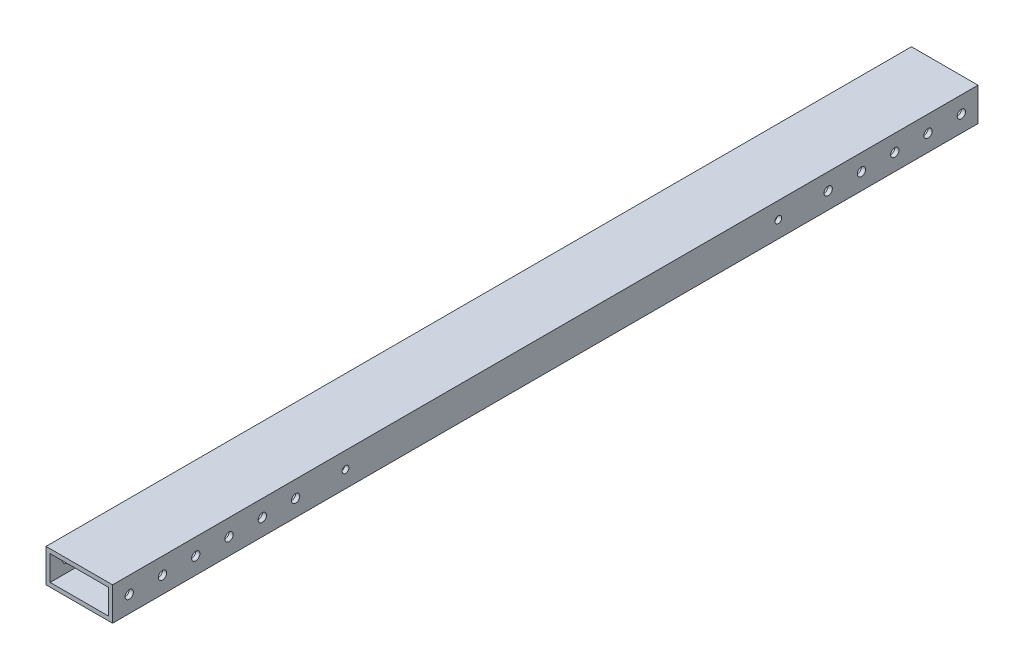
ISO-10303-21;
HEADER;
FILE_DESCRIPTION(('STEP AP214'),'2;1');
FILE_NAME('part.step','',(''),(''),'','','');
FILE_SCHEMA(('AUTOMOTIVE_DESIGN { 1 0 10303 214 1 1 1 1 }'));
ENDSEC;
DATA;
#1=APPLICATION_CONTEXT('core data for automotive mechanical design processes');
#2=APPLICATION_PROTOCOL_DEFINITION('international standard','automotive_design',2000,#1);
#3=PRODUCT_CONTEXT('',#1,'mechanical');
#4=PRODUCT('Part','Part','',(#3));
#5=PRODUCT_RELATED_PRODUCT_CATEGORY('part','',(#4));
#6=PRODUCT_DEFINITION_FORMATION('','',#4);
#7=PRODUCT_DEFINITION_CONTEXT('part definition',#1,'design');
#8=PRODUCT_DEFINITION('design','',#6,#7);
#9=PRODUCT_DEFINITION_SHAPE('','',#8);
#10=(LENGTH_UNIT() NAMED_UNIT(*) SI_UNIT(.MILLI.,.METRE.));
#11=(NAMED_UNIT(*) PLANE_ANGLE_UNIT() SI_UNIT($,.RADIAN.));
#12=(NAMED_UNIT(*) SI_UNIT($,.STERADIAN.) SOLID_ANGLE_UNIT());
#13=UNCERTAINTY_MEASURE_WITH_UNIT(LENGTH_MEASURE(1.E-05),#10,'distance_accuracy_value','');
#14=(GEOMETRIC_REPRESENTATION_CONTEXT(3) GLOBAL_UNCERTAINTY_ASSIGNED_CONTEXT((#13)) GLOBAL_UNIT_ASSIGNED_CONTEXT((#10,
#11,#12)) REPRESENTATION_CONTEXT('',''));
#15=CARTESIAN_POINT('',(0.,0.,0.));
#16=DIRECTION('',(0.,0.,1.));
#17=DIRECTION('',(1.,0.,0.));
#18=AXIS2_PLACEMENT_3D('',#15,#16,#17);
#19=CARTESIAN_POINT('',(0.,0.,330.2));
#20=DIRECTION('',(0.,0.,1.));
#21=DIRECTION('',(1.,0.,0.));
#22=AXIS2_PLACEMENT_3D('',#19,#20,#21);
#23=PLANE('',#22);
#24=DIRECTION('',(0.,-1.,0.));
#25=VECTOR('',#24,1.);
#26=CARTESIAN_POINT('',(-25.4,12.7,330.2));
#27=LINE('',#26,#25);
#28=CARTESIAN_POINT('',(-25.4,12.7,330.2));
#29=VERTEX_POINT('',#28);
#30=CARTESIAN_POINT('',(-25.4,-12.7,330.2));
#31=VERTEX_POINT('',#30);
#32=EDGE_CURVE('E115',#29,#31,#27,.T.);
#33=ORIENTED_EDGE('',*,*,#32,.T.);
#34=DIRECTION('',(1.,0.,0.));
#35=VECTOR('',#34,1.);
#36=CARTESIAN_POINT('',(-25.4,-12.7,330.2));
#37=LINE('',#36,#35);
#38=CARTESIAN_POINT('',(25.4,-12.7,330.2));
#39=VERTEX_POINT('',#38);
#40=EDGE_CURVE('E163',#31,#39,#37,.T.);
#41=ORIENTED_EDGE('',*,*,#40,.T.);
#42=DIRECTION('',(0.,1.,0.));
#43=VECTOR('',#42,1.);
#44=CARTESIAN_POINT('',(25.4,-12.7,330.2));
#45=LINE('',#44,#43);
#46=CARTESIAN_POINT('',(25.4,12.7,330.2));
#47=VERTEX_POINT('',#46);
#48=EDGE_CURVE('E165',#39,#47,#45,.T.);
#49=ORIENTED_EDGE('',*,*,#48,.T.);
#50=DIRECTION('',(-1.,0.,0.));
#51=VECTOR('',#50,1.);
#52=CARTESIAN_POINT('',(25.4,12.7,330.2));
#53=LINE('',#52,#51);
#54=EDGE_CURVE('E62',#47,#29,#53,.T.);
#55=ORIENTED_EDGE('',*,*,#54,.T.);
#56=EDGE_LOOP('',(#33,#41,#49,#55));
#57=FACE_BOUND('',#56,.T.);
#58=DIRECTION('',(1.,0.,0.));
#59=VECTOR('',#58,1.);
#60=CARTESIAN_POINT('',(-22.225,-9.525,330.2));
#61=LINE('',#60,#59);
#62=CARTESIAN_POINT('',(-22.225,-9.525,330.2));
#63=VERTEX_POINT('',#62);
#64=CARTESIAN_POINT('',(22.225,-9.525,330.2));
#65=VERTEX_POINT('',#64);
#66=EDGE_CURVE('E152',#63,#65,#61,.T.);
#67=ORIENTED_EDGE('',*,*,#66,.F.);
#68=DIRECTION('',(0.,-1.,0.));
#69=VECTOR('',#68,1.);
#70=CARTESIAN_POINT('',(-22.225,9.525,330.2));
#71=LINE('',#70,#69);
#72=CARTESIAN_POINT('',(-22.225,9.525,330.2));
#73=VERTEX_POINT('',#72);
#74=EDGE_CURVE('E112',#73,#63,#71,.T.);
#75=ORIENTED_EDGE('',*,*,#74,.F.);
#76=DIRECTION('',(-1.,0.,0.));
#77=VECTOR('',#76,1.);
#78=CARTESIAN_POINT('',(22.225,9.525,330.2));
#79=LINE('',#78,#77);
#80=CARTESIAN_POINT('',(22.225,9.525,330.2));
#81=VERTEX_POINT('',#80);
#82=EDGE_CURVE('E156',#81,#73,#79,.T.);
#83=ORIENTED_EDGE('',*,*,#82,.F.);
#84=DIRECTION('',(0.,1.,0.));
#85=VECTOR('',#84,1.);
#86=CARTESIAN_POINT('',(22.225,-9.525,330.2));
#87=LINE('',#86,#85);
#88=EDGE_CURVE('E154',#65,#81,#87,.T.);
#89=ORIENTED_EDGE('',*,*,#88,.F.);
#90=EDGE_LOOP('',(#67,#75,#83,#89));
#91=FACE_BOUND('',#90,.T.);
#92=ADVANCED_FACE('F37',(#57,#91),#23,.T.);
#93=CARTESIAN_POINT('',(-25.4,12.7,330.2));
#94=DIRECTION('',(1.,0.,0.));
#95=DIRECTION('',(0.,0.,-1.));
#96=AXIS2_PLACEMENT_3D('',#93,#94,#95);
#97=PLANE('',#96);
#98=CARTESIAN_POINT('',(-25.4,4.93690261286649E-08,-146.050000507999));
#99=DIRECTION('',(-1.,0.,0.));
#100=DIRECTION('',(0.,0.,1.));
#101=AXIS2_PLACEMENT_3D('',#98,#99,#100);
#102=CIRCLE('',#101,6.34999999999999);
#103=CARTESIAN_POINT('',(-25.4,4.93690261286649E-08,-139.700000507999));
#104=VERTEX_POINT('',#103);
#105=EDGE_CURVE('E238',#104,#104,#102,.T.);
#106=ORIENTED_EDGE('',*,*,#105,.F.);
#107=EDGE_LOOP('',(#106));
#108=FACE_BOUND('',#107,.T.);
#109=CARTESIAN_POINT('',(-25.4,1.74846271482315E-08,120.650000000001));
#110=DIRECTION('',(-1.,0.,0.));
#111=DIRECTION('',(0.,0.,1.));
#112=AXIS2_PLACEMENT_3D('',#109,#110,#111);
#113=CIRCLE('',#112,6.34999999999999);
#114=CARTESIAN_POINT('',(-25.4,1.74846271482315E-08,127.000000000001));
#115=VERTEX_POINT('',#114);
#116=EDGE_CURVE('E228',#115,#115,#113,.T.);
#117=ORIENTED_EDGE('',*,*,#116,.F.);
#118=EDGE_LOOP('',(#117));
#119=FACE_BOUND('',#118,.T.);
#120=CARTESIAN_POINT('',(-25.4,0.,152.4));
#121=DIRECTION('',(1.,0.,0.));
#122=DIRECTION('',(0.,0.,-1.));
#123=AXIS2_PLACEMENT_3D('',#120,#121,#122);
#124=CIRCLE('',#123,2.57975099999999);
#125=CARTESIAN_POINT('',(-25.4,0.,149.820249));
#126=VERTEX_POINT('',#125);
#127=EDGE_CURVE('E224',#126,#126,#124,.T.);
#128=ORIENTED_EDGE('',*,*,#127,.T.);
#129=EDGE_LOOP('',(#128));
#130=FACE_BOUND('',#129,.T.);
#131=CARTESIAN_POINT('',(-25.4,0.,-177.8));
#132=DIRECTION('',(1.,0.,0.));
#133=DIRECTION('',(0.,0.,-1.));
#134=AXIS2_PLACEMENT_3D('',#131,#132,#133);
#135=CIRCLE('',#134,2.57975099999999);
#136=CARTESIAN_POINT('',(-25.4,0.,-180.379751));
#137=VERTEX_POINT('',#136);
#138=EDGE_CURVE('E220',#137,#137,#135,.T.);
#139=ORIENTED_EDGE('',*,*,#138,.T.);
#140=EDGE_LOOP('',(#139));
#141=FACE_BOUND('',#140,.T.);
#142=CARTESIAN_POINT('',(-25.4,0.,266.7));
#143=DIRECTION('',(1.,0.,0.));
#144=DIRECTION('',(0.,0.,-1.));
#145=AXIS2_PLACEMENT_3D('',#142,#143,#144);
#146=CIRCLE('',#145,3.17499999999998);
#147=CARTESIAN_POINT('',(-25.4,0.,263.525));
#148=VERTEX_POINT('',#147);
#149=EDGE_CURVE('E215',#148,#148,#146,.T.);
#150=ORIENTED_EDGE('',*,*,#149,.T.);
#151=EDGE_LOOP('',(#150));
#152=FACE_BOUND('',#151,.T.);
#153=CARTESIAN_POINT('',(-25.4,0.,241.3));
#154=DIRECTION('',(1.,0.,0.));
#155=DIRECTION('',(0.,0.,-1.));
#156=AXIS2_PLACEMENT_3D('',#153,#154,#155);
#157=CIRCLE('',#156,3.17499999999998);
#158=CARTESIAN_POINT('',(-25.4,0.,238.125));
#159=VERTEX_POINT('',#158);
#160=EDGE_CURVE('E210',#159,#159,#157,.T.);
#161=ORIENTED_EDGE('',*,*,#160,.T.);
#162=EDGE_LOOP('',(#161));
#163=FACE_BOUND('',#162,.T.);
#164=CARTESIAN_POINT('',(-25.4,0.,190.5));
#165=DIRECTION('',(1.,0.,0.));
#166=DIRECTION('',(0.,0.,-1.));
#167=AXIS2_PLACEMENT_3D('',#164,#165,#166);
#168=CIRCLE('',#167,3.17499999999998);
#169=CARTESIAN_POINT('',(-25.4,0.,187.325));
#170=VERTEX_POINT('',#169);
#171=EDGE_CURVE('E205',#170,#170,#168,.T.);
#172=ORIENTED_EDGE('',*,*,#171,.T.);
#173=EDGE_LOOP('',(#172));
#174=FACE_BOUND('',#173,.T.);
#175=CARTESIAN_POINT('',(-25.4,0.,215.9));
#176=DIRECTION('',(1.,0.,0.));
#177=DIRECTION('',(0.,0.,-1.));
#178=AXIS2_PLACEMENT_3D('',#175,#176,#177);
#179=CIRCLE('',#178,3.17499999999998);
#180=CARTESIAN_POINT('',(-25.4,0.,212.725));
#181=VERTEX_POINT('',#180);
#182=EDGE_CURVE('E276',#181,#181,#179,.T.);
#183=ORIENTED_EDGE('',*,*,#182,.T.);
#184=EDGE_LOOP('',(#183));
#185=FACE_BOUND('',#184,.T.);
#186=CARTESIAN_POINT('',(-25.4,0.,-215.9));
#187=DIRECTION('',(1.,0.,0.));
#188=DIRECTION('',(0.,0.,-1.));
#189=AXIS2_PLACEMENT_3D('',#186,#187,#188);
#190=CIRCLE('',#189,3.17499999999999);
#191=CARTESIAN_POINT('',(-25.4,0.,-219.075));
#192=VERTEX_POINT('',#191);
#193=EDGE_CURVE('E200',#192,#192,#190,.T.);
#194=ORIENTED_EDGE('',*,*,#193,.T.);
#195=EDGE_LOOP('',(#194));
#196=FACE_BOUND('',#195,.T.);
#197=CARTESIAN_POINT('',(-25.4,0.,-241.3));
#198=DIRECTION('',(1.,0.,0.));
#199=DIRECTION('',(0.,0.,-1.));
#200=AXIS2_PLACEMENT_3D('',#197,#198,#199);
#201=CIRCLE('',#200,3.17499999999999);
#202=CARTESIAN_POINT('',(-25.4,0.,-244.475));
#203=VERTEX_POINT('',#202);
#204=EDGE_CURVE('E295',#203,#203,#201,.T.);
#205=ORIENTED_EDGE('',*,*,#204,.T.);
#206=EDGE_LOOP('',(#205));
#207=FACE_BOUND('',#206,.T.);
#208=CARTESIAN_POINT('',(-25.4,0.,-292.1));
#209=DIRECTION('',(1.,0.,0.));
#210=DIRECTION('',(0.,0.,-1.));
#211=AXIS2_PLACEMENT_3D('',#208,#209,#210);
#212=CIRCLE('',#211,3.17499999999998);
#213=CARTESIAN_POINT('',(-25.4,0.,-295.275));
#214=VERTEX_POINT('',#213);
#215=EDGE_CURVE('E195',#214,#214,#212,.T.);
#216=ORIENTED_EDGE('',*,*,#215,.T.);
#217=EDGE_LOOP('',(#216));
#218=FACE_BOUND('',#217,.T.);
#219=CARTESIAN_POINT('',(-25.4,0.,-266.7));
#220=DIRECTION('',(1.,0.,0.));
#221=DIRECTION('',(0.,0.,-1.));
#222=AXIS2_PLACEMENT_3D('',#219,#220,#221);
#223=CIRCLE('',#222,3.17499999999998);
#224=CARTESIAN_POINT('',(-25.4,0.,-269.875));
#225=VERTEX_POINT('',#224);
#226=EDGE_CURVE('E190',#225,#225,#223,.T.);
#227=ORIENTED_EDGE('',*,*,#226,.T.);
#228=EDGE_LOOP('',(#227));
#229=FACE_BOUND('',#228,.T.);
#230=CARTESIAN_POINT('',(-25.4,0.,292.1));
#231=DIRECTION('',(-1.,0.,0.));
#232=DIRECTION('',(0.,0.,1.));
#233=AXIS2_PLACEMENT_3D('',#230,#231,#232);
#234=CIRCLE('',#233,3.17499999999999);
#235=CARTESIAN_POINT('',(-25.4,0.,295.275));
#236=VERTEX_POINT('',#235);
#237=EDGE_CURVE('E318',#236,#236,#234,.T.);
#238=ORIENTED_EDGE('',*,*,#237,.F.);
#239=EDGE_LOOP('',(#238));
#240=FACE_BOUND('',#239,.T.);
#241=CARTESIAN_POINT('',(-25.4,0.,317.5));
#242=DIRECTION('',(-1.,0.,0.));
#243=DIRECTION('',(0.,0.,1.));
#244=AXIS2_PLACEMENT_3D('',#241,#242,#243);
#245=CIRCLE('',#244,3.17499999999999);
#246=CARTESIAN_POINT('',(-25.4,0.,320.675));
#247=VERTEX_POINT('',#246);
#248=EDGE_CURVE('E325',#247,#247,#245,.T.);
#249=ORIENTED_EDGE('',*,*,#248,.F.);
#250=EDGE_LOOP('',(#249));
#251=FACE_BOUND('',#250,.T.);
#252=CARTESIAN_POINT('',(-25.4,0.,-317.5));
#253=DIRECTION('',(-1.,0.,0.));
#254=DIRECTION('',(0.,0.,1.));
#255=AXIS2_PLACEMENT_3D('',#252,#253,#254);
#256=CIRCLE('',#255,3.17499999999999);
#257=CARTESIAN_POINT('',(-25.4,0.,-314.325));
#258=VERTEX_POINT('',#257);
#259=EDGE_CURVE('E332',#258,#258,#256,.T.);
#260=ORIENTED_EDGE('',*,*,#259,.F.);
#261=EDGE_LOOP('',(#260));
#262=FACE_BOUND('',#261,.T.);
#263=DIRECTION('',(0.,0.,-1.));
#264=VECTOR('',#263,1.);
#265=CARTESIAN_POINT('',(-25.4,12.7,330.2));
#266=LINE('',#265,#264);
#267=CARTESIAN_POINT('',(-25.4,12.7,-330.2));
#268=VERTEX_POINT('',#267);
#269=EDGE_CURVE('E168',#29,#268,#266,.T.);
#270=ORIENTED_EDGE('',*,*,#269,.T.);
#271=DIRECTION('',(0.,-1.,0.));
#272=VECTOR('',#271,1.);
#273=CARTESIAN_POINT('',(-25.4,12.7,-330.2));
#274=LINE('',#273,#272);
#275=CARTESIAN_POINT('',(-25.4,-12.7,-330.2));
#276=VERTEX_POINT('',#275);
#277=EDGE_CURVE('E139',#268,#276,#274,.T.);
#278=ORIENTED_EDGE('',*,*,#277,.T.);
#279=DIRECTION('',(0.,0.,-1.));
#280=VECTOR('',#279,1.);
#281=CARTESIAN_POINT('',(-25.4,-12.7,330.2));
#282=LINE('',#281,#280);
#283=EDGE_CURVE('E11',#31,#276,#282,.T.);
#284=ORIENTED_EDGE('',*,*,#283,.F.);
#285=ORIENTED_EDGE('',*,*,#32,.F.);
#286=EDGE_LOOP('',(#270,#278,#284,#285));
#287=FACE_BOUND('',#286,.T.);
#288=ADVANCED_FACE('F39',(#108,#119,#130,#141,#152,#163,#174,#185,#196,#207,#218,#229,#240,#251,
#262,#287),#97,.F.);
#289=CARTESIAN_POINT('',(-25.4,-12.7,330.2));
#290=DIRECTION('',(0.,1.,0.));
#291=DIRECTION('',(-1.,0.,0.));
#292=AXIS2_PLACEMENT_3D('',#289,#290,#291);
#293=PLANE('',#292);
#294=ORIENTED_EDGE('',*,*,#283,.T.);
#295=DIRECTION('',(1.,0.,0.));
#296=VECTOR('',#295,1.);
#297=CARTESIAN_POINT('',(-25.4,-12.7,-330.2));
#298=LINE('',#297,#296);
#299=CARTESIAN_POINT('',(25.4,-12.7,-330.2));
#300=VERTEX_POINT('',#299);
#301=EDGE_CURVE('E142',#276,#300,#298,.T.);
#302=ORIENTED_EDGE('',*,*,#301,.T.);
#303=DIRECTION('',(0.,0.,-1.));
#304=VECTOR('',#303,1.);
#305=CARTESIAN_POINT('',(25.4,-12.7,330.2));
#306=LINE('',#305,#304);
#307=EDGE_CURVE('E46',#39,#300,#306,.T.);
#308=ORIENTED_EDGE('',*,*,#307,.F.);
#309=ORIENTED_EDGE('',*,*,#40,.F.);
#310=EDGE_LOOP('',(#294,#302,#308,#309));
#311=FACE_BOUND('',#310,.T.);
#312=ADVANCED_FACE('F360',(#311),#293,.F.);
#313=CARTESIAN_POINT('',(25.4,-12.7,330.2));
#314=DIRECTION('',(-1.,0.,0.));
#315=DIRECTION('',(0.,0.,1.));
#316=AXIS2_PLACEMENT_3D('',#313,#314,#315);
#317=PLANE('',#316);
#318=CARTESIAN_POINT('',(25.4,0.,152.4));
#319=DIRECTION('',(1.,0.,0.));
#320=DIRECTION('',(0.,0.,-1.));
#321=AXIS2_PLACEMENT_3D('',#318,#319,#320);
#322=CIRCLE('',#321,2.57975099999999);
#323=CARTESIAN_POINT('',(25.4,0.,149.820249));
#324=VERTEX_POINT('',#323);
#325=EDGE_CURVE('E227',#324,#324,#322,.T.);
#326=ORIENTED_EDGE('',*,*,#325,.F.);
#327=EDGE_LOOP('',(#326));
#328=FACE_BOUND('',#327,.T.);
#329=CARTESIAN_POINT('',(25.4,0.,-177.8));
#330=DIRECTION('',(1.,0.,0.));
#331=DIRECTION('',(0.,0.,-1.));
#332=AXIS2_PLACEMENT_3D('',#329,#330,#331);
#333=CIRCLE('',#332,2.57975099999999);
#334=CARTESIAN_POINT('',(25.4,0.,-180.379751));
#335=VERTEX_POINT('',#334);
#336=EDGE_CURVE('E245',#335,#335,#333,.T.);
#337=ORIENTED_EDGE('',*,*,#336,.F.);
#338=EDGE_LOOP('',(#337));
#339=FACE_BOUND('',#338,.T.);
#340=CARTESIAN_POINT('',(25.4,0.,266.7));
#341=DIRECTION('',(1.,0.,0.));
#342=DIRECTION('',(0.,0.,-1.));
#343=AXIS2_PLACEMENT_3D('',#340,#341,#342);
#344=CIRCLE('',#343,3.17499999999999);
#345=CARTESIAN_POINT('',(25.4,0.,263.525));
#346=VERTEX_POINT('',#345);
#347=EDGE_CURVE('E252',#346,#346,#344,.T.);
#348=ORIENTED_EDGE('',*,*,#347,.F.);
#349=EDGE_LOOP('',(#348));
#350=FACE_BOUND('',#349,.T.);
#351=CARTESIAN_POINT('',(25.4,0.,241.3));
#352=DIRECTION('',(1.,0.,0.));
#353=DIRECTION('',(0.,0.,-1.));
#354=AXIS2_PLACEMENT_3D('',#351,#352,#353);
#355=CIRCLE('',#354,3.17499999999999);
#356=CARTESIAN_POINT('',(25.4,0.,238.125));
#357=VERTEX_POINT('',#356);
#358=EDGE_CURVE('E259',#357,#357,#355,.T.);
#359=ORIENTED_EDGE('',*,*,#358,.F.);
#360=EDGE_LOOP('',(#359));
#361=FACE_BOUND('',#360,.T.);
#362=CARTESIAN_POINT('',(25.4,0.,190.5));
#363=DIRECTION('',(1.,0.,0.));
#364=DIRECTION('',(0.,0.,-1.));
#365=AXIS2_PLACEMENT_3D('',#362,#363,#364);
#366=CIRCLE('',#365,3.17499999999999);
#367=CARTESIAN_POINT('',(25.4,0.,187.325));
#368=VERTEX_POINT('',#367);
#369=EDGE_CURVE('E266',#368,#368,#366,.T.);
#370=ORIENTED_EDGE('',*,*,#369,.F.);
#371=EDGE_LOOP('',(#370));
#372=FACE_BOUND('',#371,.T.);
#373=CARTESIAN_POINT('',(25.4,0.,215.9));
#374=DIRECTION('',(1.,0.,0.));
#375=DIRECTION('',(0.,0.,-1.));
#376=AXIS2_PLACEMENT_3D('',#373,#374,#375);
#377=CIRCLE('',#376,3.17499999999999);
#378=CARTESIAN_POINT('',(25.4,0.,212.725));
#379=VERTEX_POINT('',#378);
#380=EDGE_CURVE('E273',#379,#379,#377,.T.);
#381=ORIENTED_EDGE('',*,*,#380,.F.);
#382=EDGE_LOOP('',(#381));
#383=FACE_BOUND('',#382,.T.);
#384=CARTESIAN_POINT('',(25.4,0.,-215.9));
#385=DIRECTION('',(1.,0.,0.));
#386=DIRECTION('',(0.,0.,-1.));
#387=AXIS2_PLACEMENT_3D('',#384,#385,#386);
#388=CIRCLE('',#387,3.17499999999999);
#389=CARTESIAN_POINT('',(25.4,0.,-219.075));
#390=VERTEX_POINT('',#389);
#391=EDGE_CURVE('E285',#390,#390,#388,.T.);
#392=ORIENTED_EDGE('',*,*,#391,.F.);
#393=EDGE_LOOP('',(#392));
#394=FACE_BOUND('',#393,.T.);
#395=CARTESIAN_POINT('',(25.4,0.,-241.3));
#396=DIRECTION('',(1.,0.,0.));
#397=DIRECTION('',(0.,0.,-1.));
#398=AXIS2_PLACEMENT_3D('',#395,#396,#397);
#399=CIRCLE('',#398,3.17499999999999);
#400=CARTESIAN_POINT('',(25.4,0.,-244.475));
#401=VERTEX_POINT('',#400);
#402=EDGE_CURVE('E292',#401,#401,#399,.T.);
#403=ORIENTED_EDGE('',*,*,#402,.F.);
#404=EDGE_LOOP('',(#403));
#405=FACE_BOUND('',#404,.T.);
#406=CARTESIAN_POINT('',(25.4,0.,-292.1));
#407=DIRECTION('',(1.,0.,0.));
#408=DIRECTION('',(0.,0.,-1.));
#409=AXIS2_PLACEMENT_3D('',#406,#407,#408);
#410=CIRCLE('',#409,3.17499999999999);
#411=CARTESIAN_POINT('',(25.4,0.,-295.275));
#412=VERTEX_POINT('',#411);
#413=EDGE_CURVE('E304',#412,#412,#410,.T.);
#414=ORIENTED_EDGE('',*,*,#413,.F.);
#415=EDGE_LOOP('',(#414));
#416=FACE_BOUND('',#415,.T.);
#417=CARTESIAN_POINT('',(25.4,0.,-266.7));
#418=DIRECTION('',(1.,0.,0.));
#419=DIRECTION('',(0.,0.,-1.));
#420=AXIS2_PLACEMENT_3D('',#417,#418,#419);
#421=CIRCLE('',#420,3.17499999999999);
#422=CARTESIAN_POINT('',(25.4,0.,-269.875));
#423=VERTEX_POINT('',#422);
#424=EDGE_CURVE('E311',#423,#423,#421,.T.);
#425=ORIENTED_EDGE('',*,*,#424,.F.);
#426=EDGE_LOOP('',(#425));
#427=FACE_BOUND('',#426,.T.);
#428=CARTESIAN_POINT('',(25.4,0.,292.1));
#429=DIRECTION('',(-1.,0.,0.));
#430=DIRECTION('',(0.,0.,1.));
#431=AXIS2_PLACEMENT_3D('',#428,#429,#430);
#432=CIRCLE('',#431,3.17499999999998);
#433=CARTESIAN_POINT('',(25.4,0.,295.275));
#434=VERTEX_POINT('',#433);
#435=EDGE_CURVE('E185',#434,#434,#432,.T.);
#436=ORIENTED_EDGE('',*,*,#435,.T.);
#437=EDGE_LOOP('',(#436));
#438=FACE_BOUND('',#437,.T.);
#439=CARTESIAN_POINT('',(25.4,0.,317.5));
#440=DIRECTION('',(-1.,0.,0.));
#441=DIRECTION('',(0.,0.,1.));
#442=AXIS2_PLACEMENT_3D('',#439,#440,#441);
#443=CIRCLE('',#442,3.17499999999998);
#444=CARTESIAN_POINT('',(25.4,0.,320.675));
#445=VERTEX_POINT('',#444);
#446=EDGE_CURVE('E180',#445,#445,#443,.T.);
#447=ORIENTED_EDGE('',*,*,#446,.T.);
#448=EDGE_LOOP('',(#447));
#449=FACE_BOUND('',#448,.T.);
#450=CARTESIAN_POINT('',(25.4,0.,-317.5));
#451=DIRECTION('',(-1.,0.,0.));
#452=DIRECTION('',(0.,0.,1.));
#453=AXIS2_PLACEMENT_3D('',#450,#451,#452);
#454=CIRCLE('',#453,3.17499999999998);
#455=CARTESIAN_POINT('',(25.4,0.,-314.325));
#456=VERTEX_POINT('',#455);
#457=EDGE_CURVE('E175',#456,#456,#454,.T.);
#458=ORIENTED_EDGE('',*,*,#457,.T.);
#459=EDGE_LOOP('',(#458));
#460=FACE_BOUND('',#459,.T.);
#461=ORIENTED_EDGE('',*,*,#307,.T.);
#462=DIRECTION('',(0.,1.,0.));
#463=VECTOR('',#462,1.);
#464=CARTESIAN_POINT('',(25.4,-12.7,-330.2));
#465=LINE('',#464,#463);
#466=CARTESIAN_POINT('',(25.4,12.7,-330.2));
#467=VERTEX_POINT('',#466);
#468=EDGE_CURVE('E145',#300,#467,#465,.T.);
#469=ORIENTED_EDGE('',*,*,#468,.T.);
#470=DIRECTION('',(0.,0.,-1.));
#471=VECTOR('',#470,1.);
#472=CARTESIAN_POINT('',(25.4,12.7,330.2));
#473=LINE('',#472,#471);
#474=EDGE_CURVE('E170',#47,#467,#473,.T.);
#475=ORIENTED_EDGE('',*,*,#474,.F.);
#476=ORIENTED_EDGE('',*,*,#48,.F.);
#477=EDGE_LOOP('',(#461,#469,#475,#476));
#478=FACE_BOUND('',#477,.T.);
#479=ADVANCED_FACE('F337',(#328,#339,#350,#361,#372,#383,#394,#405,#416,#427,#438,#449,#460,
#478),#317,.F.);
#480=CARTESIAN_POINT('',(25.4,12.7,330.2));
#481=DIRECTION('',(0.,-1.,0.));
#482=DIRECTION('',(1.,0.,0.));
#483=AXIS2_PLACEMENT_3D('',#480,#481,#482);
#484=PLANE('',#483);
#485=ORIENTED_EDGE('',*,*,#474,.T.);
#486=DIRECTION('',(-1.,0.,0.));
#487=VECTOR('',#486,1.);
#488=CARTESIAN_POINT('',(25.4,12.7,-330.2));
#489=LINE('',#488,#487);
#490=EDGE_CURVE('E148',#467,#268,#489,.T.);
#491=ORIENTED_EDGE('',*,*,#490,.T.);
#492=ORIENTED_EDGE('',*,*,#269,.F.);
#493=ORIENTED_EDGE('',*,*,#54,.F.);
#494=EDGE_LOOP('',(#485,#491,#492,#493));
#495=FACE_BOUND('',#494,.T.);
#496=ADVANCED_FACE('F366',(#495),#484,.F.);
#497=CARTESIAN_POINT('',(-22.225,9.525,330.2));
#498=DIRECTION('',(1.,0.,0.));
#499=DIRECTION('',(0.,1.,0.));
#500=AXIS2_PLACEMENT_3D('',#497,#498,#499);
#501=PLANE('',#500);
#502=CARTESIAN_POINT('',(-22.225,4.93690261286649E-08,-146.050000507999));
#503=DIRECTION('',(1.,0.,0.));
#504=DIRECTION('',(0.,1.,0.));
#505=AXIS2_PLACEMENT_3D('',#502,#503,#504);
#506=CIRCLE('',#505,6.34999999999999);
#507=CARTESIAN_POINT('',(-22.225,6.35000004936901,-146.050000507999));
#508=VERTEX_POINT('',#507);
#509=EDGE_CURVE('E41',#508,#508,#506,.T.);
#510=ORIENTED_EDGE('',*,*,#509,.F.);
#511=EDGE_LOOP('',(#510));
#512=FACE_BOUND('',#511,.T.);
#513=CARTESIAN_POINT('',(-22.225,1.74846271482315E-08,120.650000000001));
#514=DIRECTION('',(1.,0.,0.));
#515=DIRECTION('',(0.,1.,0.));
#516=AXIS2_PLACEMENT_3D('',#513,#514,#515);
#517=CIRCLE('',#516,6.34999999999999);
#518=CARTESIAN_POINT('',(-22.225,6.35000001748462,120.650000000001));
#519=VERTEX_POINT('',#518);
#520=EDGE_CURVE('E225',#519,#519,#517,.T.);
#521=ORIENTED_EDGE('',*,*,#520,.F.);
#522=EDGE_LOOP('',(#521));
#523=FACE_BOUND('',#522,.T.);
#524=CARTESIAN_POINT('',(-22.225,0.,152.4));
#525=DIRECTION('',(1.,0.,0.));
#526=DIRECTION('',(0.,1.,0.));
#527=AXIS2_PLACEMENT_3D('',#524,#525,#526);
#528=CIRCLE('',#527,2.57975099999999);
#529=CARTESIAN_POINT('',(-22.225,2.57975099999999,152.4));
#530=VERTEX_POINT('',#529);
#531=EDGE_CURVE('E223',#530,#530,#528,.T.);
#532=ORIENTED_EDGE('',*,*,#531,.F.);
#533=EDGE_LOOP('',(#532));
#534=FACE_BOUND('',#533,.T.);
#535=CARTESIAN_POINT('',(-22.225,0.,-177.8));
#536=DIRECTION('',(1.,0.,0.));
#537=DIRECTION('',(0.,1.,0.));
#538=AXIS2_PLACEMENT_3D('',#535,#536,#537);
#539=CIRCLE('',#538,2.57975099999999);
#540=CARTESIAN_POINT('',(-22.225,2.57975099999999,-177.8));
#541=VERTEX_POINT('',#540);
#542=EDGE_CURVE('E219',#541,#541,#539,.T.);
#543=ORIENTED_EDGE('',*,*,#542,.F.);
#544=EDGE_LOOP('',(#543));
#545=FACE_BOUND('',#544,.T.);
#546=CARTESIAN_POINT('',(-22.225,0.,266.7));
#547=DIRECTION('',(1.,0.,0.));
#548=DIRECTION('',(0.,1.,0.));
#549=AXIS2_PLACEMENT_3D('',#546,#547,#548);
#550=CIRCLE('',#549,3.17499999999998);
#551=CARTESIAN_POINT('',(-22.225,3.17499999999998,266.7));
#552=VERTEX_POINT('',#551);
#553=EDGE_CURVE('E211',#552,#552,#550,.T.);
#554=ORIENTED_EDGE('',*,*,#553,.F.);
#555=EDGE_LOOP('',(#554));
#556=FACE_BOUND('',#555,.T.);
#557=CARTESIAN_POINT('',(-22.225,0.,241.3));
#558=DIRECTION('',(1.,0.,0.));
#559=DIRECTION('',(0.,1.,0.));
#560=AXIS2_PLACEMENT_3D('',#557,#558,#559);
#561=CIRCLE('',#560,3.17499999999998);
#562=CARTESIAN_POINT('',(-22.225,3.17499999999998,241.3));
#563=VERTEX_POINT('',#562);
#564=EDGE_CURVE('E209',#563,#563,#561,.T.);
#565=ORIENTED_EDGE('',*,*,#564,.F.);
#566=EDGE_LOOP('',(#565));
#567=FACE_BOUND('',#566,.T.);
#568=CARTESIAN_POINT('',(-22.225,0.,190.5));
#569=DIRECTION('',(1.,0.,0.));
#570=DIRECTION('',(0.,1.,0.));
#571=AXIS2_PLACEMENT_3D('',#568,#569,#570);
#572=CIRCLE('',#571,3.17499999999998);
#573=CARTESIAN_POINT('',(-22.225,3.17499999999998,190.5));
#574=VERTEX_POINT('',#573);
#575=EDGE_CURVE('E204',#574,#574,#572,.T.);
#576=ORIENTED_EDGE('',*,*,#575,.F.);
#577=EDGE_LOOP('',(#576));
#578=FACE_BOUND('',#577,.T.);
#579=CARTESIAN_POINT('',(-22.225,0.,215.9));
#580=DIRECTION('',(1.,0.,0.));
#581=DIRECTION('',(0.,1.,0.));
#582=AXIS2_PLACEMENT_3D('',#579,#580,#581);
#583=CIRCLE('',#582,3.17499999999998);
#584=CARTESIAN_POINT('',(-22.225,3.17499999999998,215.9));
#585=VERTEX_POINT('',#584);
#586=EDGE_CURVE('E279',#585,#585,#583,.T.);
#587=ORIENTED_EDGE('',*,*,#586,.F.);
#588=EDGE_LOOP('',(#587));
#589=FACE_BOUND('',#588,.T.);
#590=CARTESIAN_POINT('',(-22.225,0.,-215.9));
#591=DIRECTION('',(1.,0.,0.));
#592=DIRECTION('',(0.,1.,0.));
#593=AXIS2_PLACEMENT_3D('',#590,#591,#592);
#594=CIRCLE('',#593,3.17499999999999);
#595=CARTESIAN_POINT('',(-22.225,3.17499999999999,-215.9));
#596=VERTEX_POINT('',#595);
#597=EDGE_CURVE('E199',#596,#596,#594,.T.);
#598=ORIENTED_EDGE('',*,*,#597,.F.);
#599=EDGE_LOOP('',(#598));
#600=FACE_BOUND('',#599,.T.);
#601=CARTESIAN_POINT('',(-22.225,0.,-241.3));
#602=DIRECTION('',(1.,0.,0.));
#603=DIRECTION('',(0.,1.,0.));
#604=AXIS2_PLACEMENT_3D('',#601,#602,#603);
#605=CIRCLE('',#604,3.17499999999999);
#606=CARTESIAN_POINT('',(-22.225,3.17499999999999,-241.3));
#607=VERTEX_POINT('',#606);
#608=EDGE_CURVE('E301',#607,#607,#605,.T.);
#609=ORIENTED_EDGE('',*,*,#608,.F.);
#610=EDGE_LOOP('',(#609));
#611=FACE_BOUND('',#610,.T.);
#612=CARTESIAN_POINT('',(-22.225,0.,-292.1));
#613=DIRECTION('',(1.,0.,0.));
#614=DIRECTION('',(0.,1.,0.));
#615=AXIS2_PLACEMENT_3D('',#612,#613,#614);
#616=CIRCLE('',#615,3.17499999999998);
#617=CARTESIAN_POINT('',(-22.225,3.17499999999998,-292.1));
#618=VERTEX_POINT('',#617);
#619=EDGE_CURVE('E191',#618,#618,#616,.T.);
#620=ORIENTED_EDGE('',*,*,#619,.F.);
#621=EDGE_LOOP('',(#620));
#622=FACE_BOUND('',#621,.T.);
#623=CARTESIAN_POINT('',(-22.225,0.,-266.7));
#624=DIRECTION('',(1.,0.,0.));
#625=DIRECTION('',(0.,1.,0.));
#626=AXIS2_PLACEMENT_3D('',#623,#624,#625);
#627=CIRCLE('',#626,3.17499999999998);
#628=CARTESIAN_POINT('',(-22.225,3.17499999999998,-266.7));
#629=VERTEX_POINT('',#628);
#630=EDGE_CURVE('E186',#629,#629,#627,.T.);
#631=ORIENTED_EDGE('',*,*,#630,.F.);
#632=EDGE_LOOP('',(#631));
#633=FACE_BOUND('',#632,.T.);
#634=CARTESIAN_POINT('',(-22.225,0.,292.1));
#635=DIRECTION('',(1.,0.,0.));
#636=DIRECTION('',(0.,1.,0.));
#637=AXIS2_PLACEMENT_3D('',#634,#635,#636);
#638=CIRCLE('',#637,3.17499999999998);
#639=CARTESIAN_POINT('',(-22.225,3.17499999999998,292.1));
#640=VERTEX_POINT('',#639);
#641=EDGE_CURVE('E184',#640,#640,#638,.T.);
#642=ORIENTED_EDGE('',*,*,#641,.F.);
#643=EDGE_LOOP('',(#642));
#644=FACE_BOUND('',#643,.T.);
#645=CARTESIAN_POINT('',(-22.225,0.,317.5));
#646=DIRECTION('',(1.,0.,0.));
#647=DIRECTION('',(0.,1.,0.));
#648=AXIS2_PLACEMENT_3D('',#645,#646,#647);
#649=CIRCLE('',#648,3.17499999999998);
#650=CARTESIAN_POINT('',(-22.225,3.17499999999998,317.5));
#651=VERTEX_POINT('',#650);
#652=EDGE_CURVE('E176',#651,#651,#649,.T.);
#653=ORIENTED_EDGE('',*,*,#652,.F.);
#654=EDGE_LOOP('',(#653));
#655=FACE_BOUND('',#654,.T.);
#656=CARTESIAN_POINT('',(-22.225,0.,-317.5));
#657=DIRECTION('',(1.,0.,0.));
#658=DIRECTION('',(0.,1.,0.));
#659=AXIS2_PLACEMENT_3D('',#656,#657,#658);
#660=CIRCLE('',#659,3.17499999999998);
#661=CARTESIAN_POINT('',(-22.225,3.17499999999998,-317.5));
#662=VERTEX_POINT('',#661);
#663=EDGE_CURVE('E133',#662,#662,#660,.T.);
#664=ORIENTED_EDGE('',*,*,#663,.F.);
#665=EDGE_LOOP('',(#664));
#666=FACE_BOUND('',#665,.T.);
#667=DIRECTION('',(0.,0.,-1.));
#668=VECTOR('',#667,1.);
#669=CARTESIAN_POINT('',(-22.225,-9.525,330.2));
#670=LINE('',#669,#668);
#671=CARTESIAN_POINT('',(-22.225,-9.525,-330.2));
#672=VERTEX_POINT('',#671);
#673=EDGE_CURVE('E104',#63,#672,#670,.T.);
#674=ORIENTED_EDGE('',*,*,#673,.T.);
#675=DIRECTION('',(0.,-1.,0.));
#676=VECTOR('',#675,1.);
#677=CARTESIAN_POINT('',(-22.225,9.525,-330.2));
#678=LINE('',#677,#676);
#679=CARTESIAN_POINT('',(-22.225,9.525,-330.2));
#680=VERTEX_POINT('',#679);
#681=EDGE_CURVE('E109',#680,#672,#678,.T.);
#682=ORIENTED_EDGE('',*,*,#681,.F.);
#683=DIRECTION('',(0.,0.,-1.));
#684=VECTOR('',#683,1.);
#685=CARTESIAN_POINT('',(-22.225,9.525,330.2));
#686=LINE('',#685,#684);
#687=EDGE_CURVE('E158',#73,#680,#686,.T.);
#688=ORIENTED_EDGE('',*,*,#687,.F.);
#689=ORIENTED_EDGE('',*,*,#74,.T.);
#690=EDGE_LOOP('',(#674,#682,#688,#689));
#691=FACE_BOUND('',#690,.T.);
#692=ADVANCED_FACE('F106',(#512,#523,#534,#545,#556,#567,#578,#589,#600,#611,#622,#633,#644,
#655,#666,#691),#501,.T.);
#693=CARTESIAN_POINT('',(-22.225,-9.525,330.2));
#694=DIRECTION('',(0.,1.,0.));
#695=DIRECTION('',(0.,0.,1.));
#696=AXIS2_PLACEMENT_3D('',#693,#694,#695);
#697=PLANE('',#696);
#698=DIRECTION('',(0.,0.,-1.));
#699=VECTOR('',#698,1.);
#700=CARTESIAN_POINT('',(22.225,-9.525,330.2));
#701=LINE('',#700,#699);
#702=CARTESIAN_POINT('',(22.225,-9.525,-330.2));
#703=VERTEX_POINT('',#702);
#704=EDGE_CURVE('E116',#65,#703,#701,.T.);
#705=ORIENTED_EDGE('',*,*,#704,.T.);
#706=DIRECTION('',(1.,0.,0.));
#707=VECTOR('',#706,1.);
#708=CARTESIAN_POINT('',(-22.225,-9.525,-330.2));
#709=LINE('',#708,#707);
#710=EDGE_CURVE('E119',#672,#703,#709,.T.);
#711=ORIENTED_EDGE('',*,*,#710,.F.);
#712=ORIENTED_EDGE('',*,*,#673,.F.);
#713=ORIENTED_EDGE('',*,*,#66,.T.);
#714=EDGE_LOOP('',(#705,#711,#712,#713));
#715=FACE_BOUND('',#714,.T.);
#716=ADVANCED_FACE('F120',(#715),#697,.T.);
#717=CARTESIAN_POINT('',(22.225,-9.525,330.2));
#718=DIRECTION('',(-1.,0.,0.));
#719=DIRECTION('',(0.,-1.,0.));
#720=AXIS2_PLACEMENT_3D('',#717,#718,#719);
#721=PLANE('',#720);
#722=CARTESIAN_POINT('',(22.225,0.,152.4));
#723=DIRECTION('',(-1.,0.,0.));
#724=DIRECTION('',(0.,-1.,0.));
#725=AXIS2_PLACEMENT_3D('',#722,#723,#724);
#726=CIRCLE('',#725,2.57975099999999);
#727=CARTESIAN_POINT('',(22.225,-2.57975099999999,152.4));
#728=VERTEX_POINT('',#727);
#729=EDGE_CURVE('E221',#728,#728,#726,.T.);
#730=ORIENTED_EDGE('',*,*,#729,.F.);
#731=EDGE_LOOP('',(#730));
#732=FACE_BOUND('',#731,.T.);
#733=CARTESIAN_POINT('',(22.225,0.,-177.8));
#734=DIRECTION('',(-1.,0.,0.));
#735=DIRECTION('',(0.,-1.,0.));
#736=AXIS2_PLACEMENT_3D('',#733,#734,#735);
#737=CIRCLE('',#736,2.57975099999999);
#738=CARTESIAN_POINT('',(22.225,-2.579751,-177.8));
#739=VERTEX_POINT('',#738);
#740=EDGE_CURVE('E216',#739,#739,#737,.T.);
#741=ORIENTED_EDGE('',*,*,#740,.F.);
#742=EDGE_LOOP('',(#741));
#743=FACE_BOUND('',#742,.T.);
#744=CARTESIAN_POINT('',(22.225,0.,266.7));
#745=DIRECTION('',(-1.,0.,0.));
#746=DIRECTION('',(0.,-1.,0.));
#747=AXIS2_PLACEMENT_3D('',#744,#745,#746);
#748=CIRCLE('',#747,3.17499999999998);
#749=CARTESIAN_POINT('',(22.225,-3.17499999999998,266.7));
#750=VERTEX_POINT('',#749);
#751=EDGE_CURVE('E214',#750,#750,#748,.T.);
#752=ORIENTED_EDGE('',*,*,#751,.F.);
#753=EDGE_LOOP('',(#752));
#754=FACE_BOUND('',#753,.T.);
#755=CARTESIAN_POINT('',(22.225,0.,241.3));
#756=DIRECTION('',(-1.,0.,0.));
#757=DIRECTION('',(0.,-1.,0.));
#758=AXIS2_PLACEMENT_3D('',#755,#756,#757);
#759=CIRCLE('',#758,3.17499999999998);
#760=CARTESIAN_POINT('',(22.225,-3.17499999999998,241.3));
#761=VERTEX_POINT('',#760);
#762=EDGE_CURVE('E206',#761,#761,#759,.T.);
#763=ORIENTED_EDGE('',*,*,#762,.F.);
#764=EDGE_LOOP('',(#763));
#765=FACE_BOUND('',#764,.T.);
#766=CARTESIAN_POINT('',(22.225,0.,190.5));
#767=DIRECTION('',(-1.,0.,0.));
#768=DIRECTION('',(0.,-1.,0.));
#769=AXIS2_PLACEMENT_3D('',#766,#767,#768);
#770=CIRCLE('',#769,3.17499999999998);
#771=CARTESIAN_POINT('',(22.225,-3.17499999999998,190.5));
#772=VERTEX_POINT('',#771);
#773=EDGE_CURVE('E201',#772,#772,#770,.T.);
#774=ORIENTED_EDGE('',*,*,#773,.F.);
#775=EDGE_LOOP('',(#774));
#776=FACE_BOUND('',#775,.T.);
#777=CARTESIAN_POINT('',(22.225,0.,215.9));
#778=DIRECTION('',(-1.,0.,0.));
#779=DIRECTION('',(0.,-1.,0.));
#780=AXIS2_PLACEMENT_3D('',#777,#778,#779);
#781=CIRCLE('',#780,3.17499999999998);
#782=CARTESIAN_POINT('',(22.225,-3.17499999999998,215.9));
#783=VERTEX_POINT('',#782);
#784=EDGE_CURVE('E282',#783,#783,#781,.T.);
#785=ORIENTED_EDGE('',*,*,#784,.F.);
#786=EDGE_LOOP('',(#785));
#787=FACE_BOUND('',#786,.T.);
#788=CARTESIAN_POINT('',(22.225,0.,-215.9));
#789=DIRECTION('',(-1.,0.,0.));
#790=DIRECTION('',(0.,-1.,0.));
#791=AXIS2_PLACEMENT_3D('',#788,#789,#790);
#792=CIRCLE('',#791,3.17499999999999);
#793=CARTESIAN_POINT('',(22.225,-3.17499999999999,-215.9));
#794=VERTEX_POINT('',#793);
#795=EDGE_CURVE('E196',#794,#794,#792,.T.);
#796=ORIENTED_EDGE('',*,*,#795,.F.);
#797=EDGE_LOOP('',(#796));
#798=FACE_BOUND('',#797,.T.);
#799=CARTESIAN_POINT('',(22.225,0.,-241.3));
#800=DIRECTION('',(-1.,0.,0.));
#801=DIRECTION('',(0.,-1.,0.));
#802=AXIS2_PLACEMENT_3D('',#799,#800,#801);
#803=CIRCLE('',#802,3.17499999999999);
#804=CARTESIAN_POINT('',(22.225,-3.17499999999999,-241.3));
#805=VERTEX_POINT('',#804);
#806=EDGE_CURVE('E298',#805,#805,#803,.T.);
#807=ORIENTED_EDGE('',*,*,#806,.F.);
#808=EDGE_LOOP('',(#807));
#809=FACE_BOUND('',#808,.T.);
#810=CARTESIAN_POINT('',(22.225,0.,-292.1));
#811=DIRECTION('',(-1.,0.,0.));
#812=DIRECTION('',(0.,-1.,0.));
#813=AXIS2_PLACEMENT_3D('',#810,#811,#812);
#814=CIRCLE('',#813,3.17499999999998);
#815=CARTESIAN_POINT('',(22.225,-3.17499999999999,-292.1));
#816=VERTEX_POINT('',#815);
#817=EDGE_CURVE('E194',#816,#816,#814,.T.);
#818=ORIENTED_EDGE('',*,*,#817,.F.);
#819=EDGE_LOOP('',(#818));
#820=FACE_BOUND('',#819,.T.);
#821=CARTESIAN_POINT('',(22.225,0.,-266.7));
#822=DIRECTION('',(-1.,0.,0.));
#823=DIRECTION('',(0.,-1.,0.));
#824=AXIS2_PLACEMENT_3D('',#821,#822,#823);
#825=CIRCLE('',#824,3.17499999999998);
#826=CARTESIAN_POINT('',(22.225,-3.17499999999999,-266.7));
#827=VERTEX_POINT('',#826);
#828=EDGE_CURVE('E189',#827,#827,#825,.T.);
#829=ORIENTED_EDGE('',*,*,#828,.F.);
#830=EDGE_LOOP('',(#829));
#831=FACE_BOUND('',#830,.T.);
#832=CARTESIAN_POINT('',(22.225,0.,292.1));
#833=DIRECTION('',(-1.,0.,0.));
#834=DIRECTION('',(0.,-1.,0.));
#835=AXIS2_PLACEMENT_3D('',#832,#833,#834);
#836=CIRCLE('',#835,3.17499999999998);
#837=CARTESIAN_POINT('',(22.225,-3.17499999999998,292.1));
#838=VERTEX_POINT('',#837);
#839=EDGE_CURVE('E181',#838,#838,#836,.T.);
#840=ORIENTED_EDGE('',*,*,#839,.F.);
#841=EDGE_LOOP('',(#840));
#842=FACE_BOUND('',#841,.T.);
#843=CARTESIAN_POINT('',(22.225,0.,317.5));
#844=DIRECTION('',(-1.,0.,0.));
#845=DIRECTION('',(0.,-1.,0.));
#846=AXIS2_PLACEMENT_3D('',#843,#844,#845);
#847=CIRCLE('',#846,3.17499999999998);
#848=CARTESIAN_POINT('',(22.225,-3.17499999999998,317.5));
#849=VERTEX_POINT('',#848);
#850=EDGE_CURVE('E179',#849,#849,#847,.T.);
#851=ORIENTED_EDGE('',*,*,#850,.F.);
#852=EDGE_LOOP('',(#851));
#853=FACE_BOUND('',#852,.T.);
#854=CARTESIAN_POINT('',(22.225,0.,-317.5));
#855=DIRECTION('',(-1.,0.,0.));
#856=DIRECTION('',(0.,-1.,0.));
#857=AXIS2_PLACEMENT_3D('',#854,#855,#856);
#858=CIRCLE('',#857,3.17499999999998);
#859=CARTESIAN_POINT('',(22.225,-3.17499999999999,-317.5));
#860=VERTEX_POINT('',#859);
#861=EDGE_CURVE('E130',#860,#860,#858,.T.);
#862=ORIENTED_EDGE('',*,*,#861,.F.);
#863=EDGE_LOOP('',(#862));
#864=FACE_BOUND('',#863,.T.);
#865=DIRECTION('',(0.,0.,-1.));
#866=VECTOR('',#865,1.);
#867=CARTESIAN_POINT('',(22.225,9.525,330.2));
#868=LINE('',#867,#866);
#869=CARTESIAN_POINT('',(22.225,9.525,-330.2));
#870=VERTEX_POINT('',#869);
#871=EDGE_CURVE('E54',#81,#870,#868,.T.);
#872=ORIENTED_EDGE('',*,*,#871,.T.);
#873=DIRECTION('',(0.,1.,0.));
#874=VECTOR('',#873,1.);
#875=CARTESIAN_POINT('',(22.225,-9.525,-330.2));
#876=LINE('',#875,#874);
#877=EDGE_CURVE('E125',#703,#870,#876,.T.);
#878=ORIENTED_EDGE('',*,*,#877,.F.);
#879=ORIENTED_EDGE('',*,*,#704,.F.);
#880=ORIENTED_EDGE('',*,*,#88,.T.);
#881=EDGE_LOOP('',(#872,#878,#879,#880));
#882=FACE_BOUND('',#881,.T.);
#883=ADVANCED_FACE('F391',(#732,#743,#754,#765,#776,#787,#798,#809,#820,#831,#842,#853,#864,
#882),#721,.T.);
#884=CARTESIAN_POINT('',(22.225,9.525,330.2));
#885=DIRECTION('',(0.,-1.,0.));
#886=DIRECTION('',(0.,0.,-1.));
#887=AXIS2_PLACEMENT_3D('',#884,#885,#886);
#888=PLANE('',#887);
#889=ORIENTED_EDGE('',*,*,#687,.T.);
#890=DIRECTION('',(-1.,0.,0.));
#891=VECTOR('',#890,1.);
#892=CARTESIAN_POINT('',(22.225,9.525,-330.2));
#893=LINE('',#892,#891);
#894=EDGE_CURVE('E129',#870,#680,#893,.T.);
#895=ORIENTED_EDGE('',*,*,#894,.F.);
#896=ORIENTED_EDGE('',*,*,#871,.F.);
#897=ORIENTED_EDGE('',*,*,#82,.T.);
#898=EDGE_LOOP('',(#889,#895,#896,#897));
#899=FACE_BOUND('',#898,.T.);
#900=ADVANCED_FACE('F387',(#899),#888,.T.);
#901=CARTESIAN_POINT('',(0.,0.,-330.2));
#902=DIRECTION('',(0.,0.,1.));
#903=DIRECTION('',(1.,0.,0.));
#904=AXIS2_PLACEMENT_3D('',#901,#902,#903);
#905=PLANE('',#904);
#906=ORIENTED_EDGE('',*,*,#894,.T.);
#907=ORIENTED_EDGE('',*,*,#681,.T.);
#908=ORIENTED_EDGE('',*,*,#710,.T.);
#909=ORIENTED_EDGE('',*,*,#877,.T.);
#910=EDGE_LOOP('',(#906,#907,#908,#909));
#911=FACE_BOUND('',#910,.T.);
#912=ORIENTED_EDGE('',*,*,#277,.F.);
#913=ORIENTED_EDGE('',*,*,#490,.F.);
#914=ORIENTED_EDGE('',*,*,#468,.F.);
#915=ORIENTED_EDGE('',*,*,#301,.F.);
#916=EDGE_LOOP('',(#912,#913,#914,#915));
#917=FACE_BOUND('',#916,.T.);
#918=ADVANCED_FACE('F127',(#911,#917),#905,.F.);
#919=CARTESIAN_POINT('',(-25.4,0.,-317.5));
#920=DIRECTION('',(-1.,0.,0.));
#921=DIRECTION('',(0.,0.,1.));
#922=AXIS2_PLACEMENT_3D('',#919,#920,#921);
#923=CYLINDRICAL_SURFACE('',#922,3.17499999999998);
#924=ORIENTED_EDGE('',*,*,#663,.T.);
#925=EDGE_LOOP('',(#924));
#926=FACE_BOUND('',#925,.T.);
#927=ORIENTED_EDGE('',*,*,#259,.T.);
#928=EDGE_LOOP('',(#927));
#929=FACE_BOUND('',#928,.T.);
#930=ADVANCED_FACE('F343',(#926,#929),#923,.F.);
#931=ORIENTED_EDGE('',*,*,#861,.T.);
#932=EDGE_LOOP('',(#931));
#933=FACE_BOUND('',#932,.T.);
#934=ORIENTED_EDGE('',*,*,#457,.F.);
#935=EDGE_LOOP('',(#934));
#936=FACE_BOUND('',#935,.T.);
#937=ADVANCED_FACE('F340',(#933,#936),#923,.F.);
#938=CARTESIAN_POINT('',(-25.4,0.,317.5));
#939=DIRECTION('',(-1.,0.,0.));
#940=DIRECTION('',(0.,0.,1.));
#941=AXIS2_PLACEMENT_3D('',#938,#939,#940);
#942=CYLINDRICAL_SURFACE('',#941,3.17499999999998);
#943=ORIENTED_EDGE('',*,*,#652,.T.);
#944=EDGE_LOOP('',(#943));
#945=FACE_BOUND('',#944,.T.);
#946=ORIENTED_EDGE('',*,*,#248,.T.);
#947=EDGE_LOOP('',(#946));
#948=FACE_BOUND('',#947,.T.);
#949=ADVANCED_FACE('F342',(#945,#948),#942,.F.);
#950=ORIENTED_EDGE('',*,*,#850,.T.);
#951=EDGE_LOOP('',(#950));
#952=FACE_BOUND('',#951,.T.);
#953=ORIENTED_EDGE('',*,*,#446,.F.);
#954=EDGE_LOOP('',(#953));
#955=FACE_BOUND('',#954,.T.);
#956=ADVANCED_FACE('F350',(#952,#955),#942,.F.);
#957=CARTESIAN_POINT('',(-25.4,0.,292.1));
#958=DIRECTION('',(-1.,0.,0.));
#959=DIRECTION('',(0.,0.,1.));
#960=AXIS2_PLACEMENT_3D('',#957,#958,#959);
#961=CYLINDRICAL_SURFACE('',#960,3.17499999999998);
#962=ORIENTED_EDGE('',*,*,#839,.T.);
#963=EDGE_LOOP('',(#962));
#964=FACE_BOUND('',#963,.T.);
#965=ORIENTED_EDGE('',*,*,#435,.F.);
#966=EDGE_LOOP('',(#965));
#967=FACE_BOUND('',#966,.T.);
#968=ADVANCED_FACE('F442',(#964,#967),#961,.F.);
#969=ORIENTED_EDGE('',*,*,#641,.T.);
#970=EDGE_LOOP('',(#969));
#971=FACE_BOUND('',#970,.T.);
#972=ORIENTED_EDGE('',*,*,#237,.T.);
#973=EDGE_LOOP('',(#972));
#974=FACE_BOUND('',#973,.T.);
#975=ADVANCED_FACE('F438',(#971,#974),#961,.F.);
#976=CARTESIAN_POINT('',(25.4,0.,-266.7));
#977=DIRECTION('',(1.,0.,0.));
#978=DIRECTION('',(0.,0.,-1.));
#979=AXIS2_PLACEMENT_3D('',#976,#977,#978);
#980=CYLINDRICAL_SURFACE('',#979,3.17499999999998);
#981=ORIENTED_EDGE('',*,*,#630,.T.);
#982=EDGE_LOOP('',(#981));
#983=FACE_BOUND('',#982,.T.);
#984=ORIENTED_EDGE('',*,*,#226,.F.);
#985=EDGE_LOOP('',(#984));
#986=FACE_BOUND('',#985,.T.);
#987=ADVANCED_FACE('F441',(#983,#986),#980,.F.);
#988=ORIENTED_EDGE('',*,*,#828,.T.);
#989=EDGE_LOOP('',(#988));
#990=FACE_BOUND('',#989,.T.);
#991=ORIENTED_EDGE('',*,*,#424,.T.);
#992=EDGE_LOOP('',(#991));
#993=FACE_BOUND('',#992,.T.);
#994=ADVANCED_FACE('F450',(#990,#993),#980,.F.);
#995=CARTESIAN_POINT('',(25.4,0.,-292.1));
#996=DIRECTION('',(1.,0.,0.));
#997=DIRECTION('',(0.,0.,-1.));
#998=AXIS2_PLACEMENT_3D('',#995,#996,#997);
#999=CYLINDRICAL_SURFACE('',#998,3.17499999999998);
#1000=ORIENTED_EDGE('',*,*,#619,.T.);
#1001=EDGE_LOOP('',(#1000));
#1002=FACE_BOUND('',#1001,.T.);
#1003=ORIENTED_EDGE('',*,*,#215,.F.);
#1004=EDGE_LOOP('',(#1003));
#1005=FACE_BOUND('',#1004,.T.);
#1006=ADVANCED_FACE('F455',(#1002,#1005),#999,.F.);
#1007=ORIENTED_EDGE('',*,*,#817,.T.);
#1008=EDGE_LOOP('',(#1007));
#1009=FACE_BOUND('',#1008,.T.);
#1010=ORIENTED_EDGE('',*,*,#413,.T.);
#1011=EDGE_LOOP('',(#1010));
#1012=FACE_BOUND('',#1011,.T.);
#1013=ADVANCED_FACE('F458',(#1009,#1012),#999,.F.);
#1014=CARTESIAN_POINT('',(25.4,0.,-241.3));
#1015=DIRECTION('',(1.,0.,0.));
#1016=DIRECTION('',(0.,0.,-1.));
#1017=AXIS2_PLACEMENT_3D('',#1014,#1015,#1016);
#1018=CYLINDRICAL_SURFACE('',#1017,3.17499999999999);
#1019=ORIENTED_EDGE('',*,*,#806,.T.);
#1020=EDGE_LOOP('',(#1019));
#1021=FACE_BOUND('',#1020,.T.);
#1022=ORIENTED_EDGE('',*,*,#402,.T.);
#1023=EDGE_LOOP('',(#1022));
#1024=FACE_BOUND('',#1023,.T.);
#1025=ADVANCED_FACE('F460',(#1021,#1024),#1018,.F.);
#1026=ORIENTED_EDGE('',*,*,#608,.T.);
#1027=EDGE_LOOP('',(#1026));
#1028=FACE_BOUND('',#1027,.T.);
#1029=ORIENTED_EDGE('',*,*,#204,.F.);
#1030=EDGE_LOOP('',(#1029));
#1031=FACE_BOUND('',#1030,.T.);
#1032=ADVANCED_FACE('F463',(#1028,#1031),#1018,.F.);
#1033=CARTESIAN_POINT('',(25.4,0.,-215.9));
#1034=DIRECTION('',(1.,0.,0.));
#1035=DIRECTION('',(0.,0.,-1.));
#1036=AXIS2_PLACEMENT_3D('',#1033,#1034,#1035);
#1037=CYLINDRICAL_SURFACE('',#1036,3.17499999999999);
#1038=ORIENTED_EDGE('',*,*,#795,.T.);
#1039=EDGE_LOOP('',(#1038));
#1040=FACE_BOUND('',#1039,.T.);
#1041=ORIENTED_EDGE('',*,*,#391,.T.);
#1042=EDGE_LOOP('',(#1041));
#1043=FACE_BOUND('',#1042,.T.);
#1044=ADVANCED_FACE('F465',(#1040,#1043),#1037,.F.);
#1045=ORIENTED_EDGE('',*,*,#597,.T.);
#1046=EDGE_LOOP('',(#1045));
#1047=FACE_BOUND('',#1046,.T.);
#1048=ORIENTED_EDGE('',*,*,#193,.F.);
#1049=EDGE_LOOP('',(#1048));
#1050=FACE_BOUND('',#1049,.T.);
#1051=ADVANCED_FACE('F468',(#1047,#1050),#1037,.F.);
#1052=CARTESIAN_POINT('',(25.4,0.,215.9));
#1053=DIRECTION('',(1.,0.,0.));
#1054=DIRECTION('',(0.,0.,-1.));
#1055=AXIS2_PLACEMENT_3D('',#1052,#1053,#1054);
#1056=CYLINDRICAL_SURFACE('',#1055,3.17499999999998);
#1057=ORIENTED_EDGE('',*,*,#784,.T.);
#1058=EDGE_LOOP('',(#1057));
#1059=FACE_BOUND('',#1058,.T.);
#1060=ORIENTED_EDGE('',*,*,#380,.T.);
#1061=EDGE_LOOP('',(#1060));
#1062=FACE_BOUND('',#1061,.T.);
#1063=ADVANCED_FACE('F474',(#1059,#1062),#1056,.F.);
#1064=ORIENTED_EDGE('',*,*,#586,.T.);
#1065=EDGE_LOOP('',(#1064));
#1066=FACE_BOUND('',#1065,.T.);
#1067=ORIENTED_EDGE('',*,*,#182,.F.);
#1068=EDGE_LOOP('',(#1067));
#1069=FACE_BOUND('',#1068,.T.);
#1070=ADVANCED_FACE('F470',(#1066,#1069),#1056,.F.);
#1071=CARTESIAN_POINT('',(25.4,0.,190.5));
#1072=DIRECTION('',(1.,0.,0.));
#1073=DIRECTION('',(0.,0.,-1.));
#1074=AXIS2_PLACEMENT_3D('',#1071,#1072,#1073);
#1075=CYLINDRICAL_SURFACE('',#1074,3.17499999999998);
#1076=ORIENTED_EDGE('',*,*,#773,.T.);
#1077=EDGE_LOOP('',(#1076));
#1078=FACE_BOUND('',#1077,.T.);
#1079=ORIENTED_EDGE('',*,*,#369,.T.);
#1080=EDGE_LOOP('',(#1079));
#1081=FACE_BOUND('',#1080,.T.);
#1082=ADVANCED_FACE('F473',(#1078,#1081),#1075,.F.);
#1083=ORIENTED_EDGE('',*,*,#575,.T.);
#1084=EDGE_LOOP('',(#1083));
#1085=FACE_BOUND('',#1084,.T.);
#1086=ORIENTED_EDGE('',*,*,#171,.F.);
#1087=EDGE_LOOP('',(#1086));
#1088=FACE_BOUND('',#1087,.T.);
#1089=ADVANCED_FACE('F478',(#1085,#1088),#1075,.F.);
#1090=CARTESIAN_POINT('',(25.4,0.,241.3));
#1091=DIRECTION('',(1.,0.,0.));
#1092=DIRECTION('',(0.,0.,-1.));
#1093=AXIS2_PLACEMENT_3D('',#1090,#1091,#1092);
#1094=CYLINDRICAL_SURFACE('',#1093,3.17499999999998);
#1095=ORIENTED_EDGE('',*,*,#762,.T.);
#1096=EDGE_LOOP('',(#1095));
#1097=FACE_BOUND('',#1096,.T.);
#1098=ORIENTED_EDGE('',*,*,#358,.T.);
#1099=EDGE_LOOP('',(#1098));
#1100=FACE_BOUND('',#1099,.T.);
#1101=ADVANCED_FACE('F480',(#1097,#1100),#1094,.F.);
#1102=ORIENTED_EDGE('',*,*,#564,.T.);
#1103=EDGE_LOOP('',(#1102));
#1104=FACE_BOUND('',#1103,.T.);
#1105=ORIENTED_EDGE('',*,*,#160,.F.);
#1106=EDGE_LOOP('',(#1105));
#1107=FACE_BOUND('',#1106,.T.);
#1108=ADVANCED_FACE('F483',(#1104,#1107),#1094,.F.);
#1109=CARTESIAN_POINT('',(25.4,0.,266.7));
#1110=DIRECTION('',(1.,0.,0.));
#1111=DIRECTION('',(0.,0.,-1.));
#1112=AXIS2_PLACEMENT_3D('',#1109,#1110,#1111);
#1113=CYLINDRICAL_SURFACE('',#1112,3.17499999999998);
#1114=ORIENTED_EDGE('',*,*,#553,.T.);
#1115=EDGE_LOOP('',(#1114));
#1116=FACE_BOUND('',#1115,.T.);
#1117=ORIENTED_EDGE('',*,*,#149,.F.);
#1118=EDGE_LOOP('',(#1117));
#1119=FACE_BOUND('',#1118,.T.);
#1120=ADVANCED_FACE('F485',(#1116,#1119),#1113,.F.);
#1121=ORIENTED_EDGE('',*,*,#751,.T.);
#1122=EDGE_LOOP('',(#1121));
#1123=FACE_BOUND('',#1122,.T.);
#1124=ORIENTED_EDGE('',*,*,#347,.T.);
#1125=EDGE_LOOP('',(#1124));
#1126=FACE_BOUND('',#1125,.T.);
#1127=ADVANCED_FACE('F488',(#1123,#1126),#1113,.F.);
#1128=CARTESIAN_POINT('',(25.4,0.,-177.8));
#1129=DIRECTION('',(1.,0.,0.));
#1130=DIRECTION('',(0.,0.,-1.));
#1131=AXIS2_PLACEMENT_3D('',#1128,#1129,#1130);
#1132=CYLINDRICAL_SURFACE('',#1131,2.57975099999999);
#1133=ORIENTED_EDGE('',*,*,#740,.T.);
#1134=EDGE_LOOP('',(#1133));
#1135=FACE_BOUND('',#1134,.T.);
#1136=ORIENTED_EDGE('',*,*,#336,.T.);
#1137=EDGE_LOOP('',(#1136));
#1138=FACE_BOUND('',#1137,.T.);
#1139=ADVANCED_FACE('F490',(#1135,#1138),#1132,.F.);
#1140=ORIENTED_EDGE('',*,*,#542,.T.);
#1141=EDGE_LOOP('',(#1140));
#1142=FACE_BOUND('',#1141,.T.);
#1143=ORIENTED_EDGE('',*,*,#138,.F.);
#1144=EDGE_LOOP('',(#1143));
#1145=FACE_BOUND('',#1144,.T.);
#1146=ADVANCED_FACE('F493',(#1142,#1145),#1132,.F.);
#1147=CARTESIAN_POINT('',(25.4,0.,152.4));
#1148=DIRECTION('',(1.,0.,0.));
#1149=DIRECTION('',(0.,0.,-1.));
#1150=AXIS2_PLACEMENT_3D('',#1147,#1148,#1149);
#1151=CYLINDRICAL_SURFACE('',#1150,2.57975099999999);
#1152=ORIENTED_EDGE('',*,*,#729,.T.);
#1153=EDGE_LOOP('',(#1152));
#1154=FACE_BOUND('',#1153,.T.);
#1155=ORIENTED_EDGE('',*,*,#325,.T.);
#1156=EDGE_LOOP('',(#1155));
#1157=FACE_BOUND('',#1156,.T.);
#1158=ADVANCED_FACE('F495',(#1154,#1157),#1151,.F.);
#1159=ORIENTED_EDGE('',*,*,#531,.T.);
#1160=EDGE_LOOP('',(#1159));
#1161=FACE_BOUND('',#1160,.T.);
#1162=ORIENTED_EDGE('',*,*,#127,.F.);
#1163=EDGE_LOOP('',(#1162));
#1164=FACE_BOUND('',#1163,.T.);
#1165=ADVANCED_FACE('F498',(#1161,#1164),#1151,.F.);
#1166=CARTESIAN_POINT('',(-25.4,1.74846271482315E-08,120.650000000001));
#1167=DIRECTION('',(-1.,0.,0.));
#1168=DIRECTION('',(0.,0.,1.));
#1169=AXIS2_PLACEMENT_3D('',#1166,#1167,#1168);
#1170=CYLINDRICAL_SURFACE('',#1169,6.34999999999999);
#1171=ORIENTED_EDGE('',*,*,#520,.T.);
#1172=EDGE_LOOP('',(#1171));
#1173=FACE_BOUND('',#1172,.T.);
#1174=ORIENTED_EDGE('',*,*,#116,.T.);
#1175=EDGE_LOOP('',(#1174));
#1176=FACE_BOUND('',#1175,.T.);
#1177=ADVANCED_FACE('F500',(#1173,#1176),#1170,.F.);
#1178=CARTESIAN_POINT('',(-25.4,4.93690261286649E-08,-146.050000507999));
#1179=DIRECTION('',(-1.,0.,0.));
#1180=DIRECTION('',(0.,0.,1.));
#1181=AXIS2_PLACEMENT_3D('',#1178,#1179,#1180);
#1182=CYLINDRICAL_SURFACE('',#1181,6.34999999999999);
#1183=ORIENTED_EDGE('',*,*,#509,.T.);
#1184=EDGE_LOOP('',(#1183));
#1185=FACE_BOUND('',#1184,.T.);
#1186=ORIENTED_EDGE('',*,*,#105,.T.);
#1187=EDGE_LOOP('',(#1186));
#1188=FACE_BOUND('',#1187,.T.);
#1189=ADVANCED_FACE('F503',(#1185,#1188),#1182,.F.);
#1190=CLOSED_SHELL('',(#92,#288,#312,#479,#496,#692,#716,#883,#900,#918,#930,#937,#949,#956,
#968,#975,#987,#994,#1006,#1013,#1025,#1032,#1044,#1051,#1063,#1070,#1082,#1089,#1101,#1108,
#1120,#1127,#1139,#1146,#1158,#1165,#1177,#1189));
#1191=MANIFOLD_SOLID_BREP('B2',#1190);
#1192=ADVANCED_BREP_SHAPE_REPRESENTATION('',(#18,#1191),#14);
#1193=SHAPE_DEFINITION_REPRESENTATION(#9,#1192);
ENDSEC;
END-ISO-10303-21;
